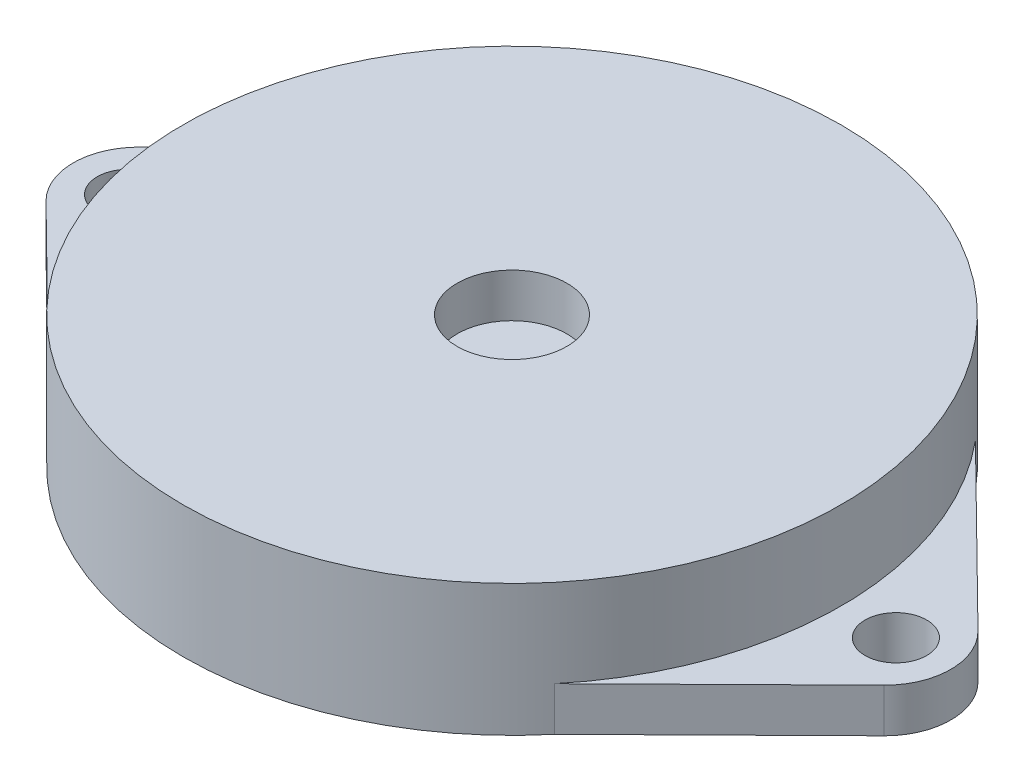
ISO-10303-21;
HEADER;
FILE_DESCRIPTION(('STEP AP214'),'2;1');
FILE_NAME('part.step','',(''),(''),'','','');
FILE_SCHEMA(('AUTOMOTIVE_DESIGN { 1 0 10303 214 1 1 1 1 }'));
ENDSEC;
DATA;
#1=APPLICATION_CONTEXT('core data for automotive mechanical design processes');
#2=APPLICATION_PROTOCOL_DEFINITION('international standard','automotive_design',2000,#1);
#3=PRODUCT_CONTEXT('',#1,'mechanical');
#4=PRODUCT('Part','Part','',(#3));
#5=PRODUCT_RELATED_PRODUCT_CATEGORY('part','',(#4));
#6=PRODUCT_DEFINITION_FORMATION('','',#4);
#7=PRODUCT_DEFINITION_CONTEXT('part definition',#1,'design');
#8=PRODUCT_DEFINITION('design','',#6,#7);
#9=PRODUCT_DEFINITION_SHAPE('','',#8);
#10=(LENGTH_UNIT() NAMED_UNIT(*) SI_UNIT(.MILLI.,.METRE.));
#11=(NAMED_UNIT(*) PLANE_ANGLE_UNIT() SI_UNIT($,.RADIAN.));
#12=(NAMED_UNIT(*) SI_UNIT($,.STERADIAN.) SOLID_ANGLE_UNIT());
#13=UNCERTAINTY_MEASURE_WITH_UNIT(LENGTH_MEASURE(1.E-05),#10,'distance_accuracy_value','');
#14=(GEOMETRIC_REPRESENTATION_CONTEXT(3) GLOBAL_UNCERTAINTY_ASSIGNED_CONTEXT((#13)) GLOBAL_UNIT_ASSIGNED_CONTEXT((#10,
#11,#12)) REPRESENTATION_CONTEXT('',''));
#15=CARTESIAN_POINT('',(0.,0.,0.));
#16=DIRECTION('',(0.,0.,1.));
#17=DIRECTION('',(1.,0.,0.));
#18=AXIS2_PLACEMENT_3D('',#15,#16,#17);
#19=CARTESIAN_POINT('',(0.,6.,0.));
#20=DIRECTION('',(0.,-1.,0.));
#21=DIRECTION('',(0.,0.,-1.));
#22=AXIS2_PLACEMENT_3D('',#19,#20,#21);
#23=CYLINDRICAL_SURFACE('',#22,15.);
#24=CARTESIAN_POINT('',(0.,0.,0.));
#25=DIRECTION('',(0.,1.,0.));
#26=DIRECTION('',(0.,0.,1.));
#27=AXIS2_PLACEMENT_3D('',#24,#25,#26);
#28=CIRCLE('',#27,15.);
#29=CARTESIAN_POINT('',(11.5272476160853,0.,-9.59804992680577));
#30=VERTEX_POINT('',#29);
#31=CARTESIAN_POINT('',(-11.5272476160853,0.,-9.59804992680576));
#32=VERTEX_POINT('',#31);
#33=EDGE_CURVE('E172',#30,#32,#28,.T.);
#34=ORIENTED_EDGE('',*,*,#33,.T.);
#35=DIRECTION('',(0.,-1.,0.));
#36=VECTOR('',#35,1.);
#37=CARTESIAN_POINT('',(-11.5272476160853,6.,-9.59804992680579));
#38=LINE('',#37,#36);
#39=CARTESIAN_POINT('',(-11.5272476160853,2.,-9.59804992680576));
#40=VERTEX_POINT('',#39);
#41=EDGE_CURVE('E166',#32,#40,#38,.F.);
#42=ORIENTED_EDGE('',*,*,#41,.T.);
#43=CARTESIAN_POINT('',(0.,2.,0.));
#44=DIRECTION('',(0.,1.,0.));
#45=DIRECTION('',(0.,0.,1.));
#46=AXIS2_PLACEMENT_3D('',#43,#44,#45);
#47=CIRCLE('',#46,15.);
#48=CARTESIAN_POINT('',(-11.5272476160853,2.,9.59804992680578));
#49=VERTEX_POINT('',#48);
#50=EDGE_CURVE('E44',#40,#49,#47,.T.);
#51=ORIENTED_EDGE('',*,*,#50,.T.);
#52=DIRECTION('',(0.,-1.,0.));
#53=VECTOR('',#52,1.);
#54=CARTESIAN_POINT('',(-11.5272476160853,6.,9.59804992680579));
#55=LINE('',#54,#53);
#56=CARTESIAN_POINT('',(-11.5272476160853,0.,9.59804992680577));
#57=VERTEX_POINT('',#56);
#58=EDGE_CURVE('E161',#49,#57,#55,.T.);
#59=ORIENTED_EDGE('',*,*,#58,.T.);
#60=CARTESIAN_POINT('',(11.5272476160853,0.,9.59804992680578));
#61=VERTEX_POINT('',#60);
#62=EDGE_CURVE('E178',#57,#61,#28,.T.);
#63=ORIENTED_EDGE('',*,*,#62,.T.);
#64=DIRECTION('',(0.,-1.,0.));
#65=VECTOR('',#64,1.);
#66=CARTESIAN_POINT('',(11.5272476160853,6.,9.59804992680579));
#67=LINE('',#66,#65);
#68=CARTESIAN_POINT('',(11.5272476160853,2.,9.59804992680576));
#69=VERTEX_POINT('',#68);
#70=EDGE_CURVE('E51',#61,#69,#67,.F.);
#71=ORIENTED_EDGE('',*,*,#70,.T.);
#72=CARTESIAN_POINT('',(0.,2.,0.));
#73=DIRECTION('',(0.,-1.,0.));
#74=DIRECTION('',(0.,0.,-1.));
#75=AXIS2_PLACEMENT_3D('',#72,#73,#74);
#76=CIRCLE('',#75,15.);
#77=CARTESIAN_POINT('',(11.5272476160853,2.,-9.59804992680578));
#78=VERTEX_POINT('',#77);
#79=EDGE_CURVE('E11',#78,#69,#76,.T.);
#80=ORIENTED_EDGE('',*,*,#79,.F.);
#81=DIRECTION('',(0.,-1.,0.));
#82=VECTOR('',#81,1.);
#83=CARTESIAN_POINT('',(11.5272476160853,6.,-9.59804992680574));
#84=LINE('',#83,#82);
#85=EDGE_CURVE('E134',#78,#30,#84,.T.);
#86=ORIENTED_EDGE('',*,*,#85,.T.);
#87=EDGE_LOOP('',(#34,#42,#51,#59,#63,#71,#80,#86));
#88=FACE_BOUND('',#87,.T.);
#89=CARTESIAN_POINT('',(0.,6.,0.));
#90=DIRECTION('',(0.,1.,0.));
#91=DIRECTION('',(0.,0.,1.));
#92=AXIS2_PLACEMENT_3D('',#89,#90,#91);
#93=CIRCLE('',#92,15.);
#94=CARTESIAN_POINT('',(0.,6.,15.));
#95=VERTEX_POINT('',#94);
#96=EDGE_CURVE('E175',#95,#95,#93,.T.);
#97=ORIENTED_EDGE('',*,*,#96,.F.);
#98=EDGE_LOOP('',(#97));
#99=FACE_BOUND('',#98,.T.);
#100=ADVANCED_FACE('F37',(#88,#99),#23,.T.);
#101=CARTESIAN_POINT('',(0.,6.,0.));
#102=DIRECTION('',(0.,1.,0.));
#103=DIRECTION('',(0.,0.,1.));
#104=AXIS2_PLACEMENT_3D('',#101,#102,#103);
#105=PLANE('',#104);
#106=CARTESIAN_POINT('',(0.,6.,0.));
#107=DIRECTION('',(0.,1.,0.));
#108=DIRECTION('',(0.,0.,1.));
#109=AXIS2_PLACEMENT_3D('',#106,#107,#108);
#110=CIRCLE('',#109,2.5);
#111=CARTESIAN_POINT('',(0.,6.,2.5));
#112=VERTEX_POINT('',#111);
#113=EDGE_CURVE('E168',#112,#112,#110,.T.);
#114=ORIENTED_EDGE('',*,*,#113,.F.);
#115=EDGE_LOOP('',(#114));
#116=FACE_BOUND('',#115,.T.);
#117=ORIENTED_EDGE('',*,*,#96,.T.);
#118=EDGE_LOOP('',(#117));
#119=FACE_BOUND('',#118,.T.);
#120=ADVANCED_FACE('F213',(#116,#119),#105,.T.);
#121=CARTESIAN_POINT('',(0.,0.,0.));
#122=DIRECTION('',(0.,1.,0.));
#123=DIRECTION('',(0.,0.,1.));
#124=AXIS2_PLACEMENT_3D('',#121,#122,#123);
#125=PLANE('',#124);
#126=DIRECTION('',(-0.712596802448825,0.,0.701573800209009));
#127=VECTOR('',#126,1.);
#128=CARTESIAN_POINT('',(9.4171922879189,0.,11.6754652760548));
#129=LINE('',#128,#127);
#130=CARTESIAN_POINT('',(19.104721400627,0.,2.13779040734648));
#131=VERTEX_POINT('',#130);
#132=EDGE_CURVE('E103',#131,#61,#129,.T.);
#133=ORIENTED_EDGE('',*,*,#132,.T.);
#134=ORIENTED_EDGE('',*,*,#62,.F.);
#135=DIRECTION('',(-0.712596802448825,0.,-0.701573800209009));
#136=VECTOR('',#135,1.);
#137=CARTESIAN_POINT('',(-9.4171922879189,0.,11.6754652760548));
#138=LINE('',#137,#136);
#139=CARTESIAN_POINT('',(-19.104721400627,0.,2.13779040734648));
#140=VERTEX_POINT('',#139);
#141=EDGE_CURVE('E140',#57,#140,#138,.T.);
#142=ORIENTED_EDGE('',*,*,#141,.T.);
#143=CARTESIAN_POINT('',(-17.,0.,0.));
#144=DIRECTION('',(0.,-1.,0.));
#145=DIRECTION('',(0.,0.,1.));
#146=AXIS2_PLACEMENT_3D('',#143,#144,#145);
#147=CIRCLE('',#146,3.);
#148=CARTESIAN_POINT('',(-19.104721400627,0.,-2.13779040734648));
#149=VERTEX_POINT('',#148);
#150=EDGE_CURVE('E154',#140,#149,#147,.T.);
#151=ORIENTED_EDGE('',*,*,#150,.T.);
#152=DIRECTION('',(0.712596802448825,0.,-0.701573800209009));
#153=VECTOR('',#152,1.);
#154=CARTESIAN_POINT('',(-9.4171922879189,0.,-11.6754652760548));
#155=LINE('',#154,#153);
#156=EDGE_CURVE('E146',#149,#32,#155,.T.);
#157=ORIENTED_EDGE('',*,*,#156,.T.);
#158=ORIENTED_EDGE('',*,*,#33,.F.);
#159=DIRECTION('',(0.712596802448825,0.,0.701573800209009));
#160=VECTOR('',#159,1.);
#161=CARTESIAN_POINT('',(9.4171922879189,0.,-11.6754652760548));
#162=LINE('',#161,#160);
#163=CARTESIAN_POINT('',(19.104721400627,0.,-2.13779040734648));
#164=VERTEX_POINT('',#163);
#165=EDGE_CURVE('E120',#30,#164,#162,.T.);
#166=ORIENTED_EDGE('',*,*,#165,.T.);
#167=CARTESIAN_POINT('',(17.,0.,0.));
#168=DIRECTION('',(0.,-1.,0.));
#169=DIRECTION('',(0.,0.,-1.));
#170=AXIS2_PLACEMENT_3D('',#167,#168,#169);
#171=CIRCLE('',#170,3.);
#172=EDGE_CURVE('E128',#164,#131,#171,.T.);
#173=ORIENTED_EDGE('',*,*,#172,.T.);
#174=EDGE_LOOP('',(#133,#134,#142,#151,#157,#158,#166,#173));
#175=FACE_BOUND('',#174,.T.);
#176=CARTESIAN_POINT('',(-17.5,0.,0.));
#177=DIRECTION('',(0.,-1.,0.));
#178=DIRECTION('',(0.,0.,-1.));
#179=AXIS2_PLACEMENT_3D('',#176,#177,#178);
#180=CIRCLE('',#179,1.40543951031206);
#181=CARTESIAN_POINT('',(-17.5,0.,-1.40543951031206));
#182=VERTEX_POINT('',#181);
#183=EDGE_CURVE('E136',#182,#182,#180,.T.);
#184=ORIENTED_EDGE('',*,*,#183,.F.);
#185=EDGE_LOOP('',(#184));
#186=FACE_BOUND('',#185,.T.);
#187=CARTESIAN_POINT('',(17.5,0.,0.));
#188=DIRECTION('',(0.,-1.,0.));
#189=DIRECTION('',(0.,0.,1.));
#190=AXIS2_PLACEMENT_3D('',#187,#188,#189);
#191=CIRCLE('',#190,1.40543951031206);
#192=CARTESIAN_POINT('',(17.5,0.,1.40543951031206));
#193=VERTEX_POINT('',#192);
#194=EDGE_CURVE('E124',#193,#193,#191,.T.);
#195=ORIENTED_EDGE('',*,*,#194,.F.);
#196=EDGE_LOOP('',(#195));
#197=FACE_BOUND('',#196,.T.);
#198=ADVANCED_FACE('F197',(#175,#186,#197),#125,.F.);
#199=CARTESIAN_POINT('',(0.,4.,0.));
#200=DIRECTION('',(0.,1.,0.));
#201=DIRECTION('',(0.,0.,1.));
#202=AXIS2_PLACEMENT_3D('',#199,#200,#201);
#203=CYLINDRICAL_SURFACE('',#202,2.5);
#204=CARTESIAN_POINT('',(0.,4.,0.));
#205=DIRECTION('',(0.,1.,0.));
#206=DIRECTION('',(0.,0.,1.));
#207=AXIS2_PLACEMENT_3D('',#204,#205,#206);
#208=CIRCLE('',#207,2.5);
#209=CARTESIAN_POINT('',(0.,4.,2.5));
#210=VERTEX_POINT('',#209);
#211=EDGE_CURVE('E169',#210,#210,#208,.T.);
#212=ORIENTED_EDGE('',*,*,#211,.F.);
#213=EDGE_LOOP('',(#212));
#214=FACE_BOUND('',#213,.T.);
#215=ORIENTED_EDGE('',*,*,#113,.T.);
#216=EDGE_LOOP('',(#215));
#217=FACE_BOUND('',#216,.T.);
#218=ADVANCED_FACE('F222',(#214,#217),#203,.F.);
#219=CARTESIAN_POINT('',(0.,4.,0.));
#220=DIRECTION('',(0.,1.,0.));
#221=DIRECTION('',(0.,0.,1.));
#222=AXIS2_PLACEMENT_3D('',#219,#220,#221);
#223=PLANE('',#222);
#224=ORIENTED_EDGE('',*,*,#211,.T.);
#225=EDGE_LOOP('',(#224));
#226=FACE_BOUND('',#225,.T.);
#227=ADVANCED_FACE('F208',(#226),#223,.T.);
#228=CARTESIAN_POINT('',(-17.,2.,0.));
#229=DIRECTION('',(0.,1.,0.));
#230=DIRECTION('',(0.,0.,1.));
#231=AXIS2_PLACEMENT_3D('',#228,#229,#230);
#232=PLANE('',#231);
#233=CARTESIAN_POINT('',(-17.5,2.,0.));
#234=DIRECTION('',(0.,-1.,0.));
#235=DIRECTION('',(0.,0.,-1.));
#236=AXIS2_PLACEMENT_3D('',#233,#234,#235);
#237=CIRCLE('',#236,1.40543951031206);
#238=CARTESIAN_POINT('',(-17.5,2.,-1.40543951031206));
#239=VERTEX_POINT('',#238);
#240=EDGE_CURVE('E137',#239,#239,#237,.T.);
#241=ORIENTED_EDGE('',*,*,#240,.T.);
#242=EDGE_LOOP('',(#241));
#243=FACE_BOUND('',#242,.T.);
#244=ORIENTED_EDGE('',*,*,#50,.F.);
#245=DIRECTION('',(0.712596802448825,0.,-0.701573800209009));
#246=VECTOR('',#245,1.);
#247=CARTESIAN_POINT('',(-9.4171922879189,2.,-11.6754652760548));
#248=LINE('',#247,#246);
#249=CARTESIAN_POINT('',(-19.104721400627,2.,-2.13779040734648));
#250=VERTEX_POINT('',#249);
#251=EDGE_CURVE('E149',#250,#40,#248,.T.);
#252=ORIENTED_EDGE('',*,*,#251,.F.);
#253=CARTESIAN_POINT('',(-17.,2.,0.));
#254=DIRECTION('',(0.,-1.,0.));
#255=DIRECTION('',(0.,0.,1.));
#256=AXIS2_PLACEMENT_3D('',#253,#254,#255);
#257=CIRCLE('',#256,3.);
#258=CARTESIAN_POINT('',(-19.104721400627,2.,2.13779040734648));
#259=VERTEX_POINT('',#258);
#260=EDGE_CURVE('E145',#259,#250,#257,.T.);
#261=ORIENTED_EDGE('',*,*,#260,.F.);
#262=DIRECTION('',(-0.712596802448825,0.,-0.701573800209009));
#263=VECTOR('',#262,1.);
#264=CARTESIAN_POINT('',(-9.4171922879189,2.,11.6754652760548));
#265=LINE('',#264,#263);
#266=EDGE_CURVE('E143',#49,#259,#265,.T.);
#267=ORIENTED_EDGE('',*,*,#266,.F.);
#268=EDGE_LOOP('',(#244,#252,#261,#267));
#269=FACE_BOUND('',#268,.T.);
#270=ADVANCED_FACE('F191',(#243,#269),#232,.T.);
#271=CARTESIAN_POINT('',(-9.4171922879189,2.,-11.6754652760548));
#272=DIRECTION('',(-0.701573800209009,0.,-0.712596802448825));
#273=DIRECTION('',(-0.712596802448825,0.,0.701573800209009));
#274=AXIS2_PLACEMENT_3D('',#271,#272,#273);
#275=PLANE('',#274);
#276=ORIENTED_EDGE('',*,*,#41,.F.);
#277=ORIENTED_EDGE('',*,*,#156,.F.);
#278=DIRECTION('',(0.,-1.,0.));
#279=VECTOR('',#278,1.);
#280=CARTESIAN_POINT('',(-19.104721400627,2.,-2.13779040734648));
#281=LINE('',#280,#279);
#282=EDGE_CURVE('E159',#250,#149,#281,.T.);
#283=ORIENTED_EDGE('',*,*,#282,.F.);
#284=ORIENTED_EDGE('',*,*,#251,.T.);
#285=EDGE_LOOP('',(#276,#277,#283,#284));
#286=FACE_BOUND('',#285,.T.);
#287=ADVANCED_FACE('F200',(#286),#275,.T.);
#288=CARTESIAN_POINT('',(-9.4171922879189,2.,11.6754652760548));
#289=DIRECTION('',(-0.701573800209009,0.,0.712596802448825));
#290=DIRECTION('',(0.712596802448825,0.,0.701573800209009));
#291=AXIS2_PLACEMENT_3D('',#288,#289,#290);
#292=PLANE('',#291);
#293=ORIENTED_EDGE('',*,*,#58,.F.);
#294=ORIENTED_EDGE('',*,*,#266,.T.);
#295=DIRECTION('',(0.,-1.,0.));
#296=VECTOR('',#295,1.);
#297=CARTESIAN_POINT('',(-19.104721400627,2.,2.13779040734648));
#298=LINE('',#297,#296);
#299=EDGE_CURVE('E152',#259,#140,#298,.T.);
#300=ORIENTED_EDGE('',*,*,#299,.T.);
#301=ORIENTED_EDGE('',*,*,#141,.F.);
#302=EDGE_LOOP('',(#293,#294,#300,#301));
#303=FACE_BOUND('',#302,.T.);
#304=ADVANCED_FACE('F188',(#303),#292,.T.);
#305=CARTESIAN_POINT('',(-17.,2.,0.));
#306=DIRECTION('',(0.,-1.,0.));
#307=DIRECTION('',(0.,0.,-1.));
#308=AXIS2_PLACEMENT_3D('',#305,#306,#307);
#309=CYLINDRICAL_SURFACE('',#308,3.);
#310=ORIENTED_EDGE('',*,*,#150,.F.);
#311=ORIENTED_EDGE('',*,*,#299,.F.);
#312=ORIENTED_EDGE('',*,*,#260,.T.);
#313=ORIENTED_EDGE('',*,*,#282,.T.);
#314=EDGE_LOOP('',(#310,#311,#312,#313));
#315=FACE_BOUND('',#314,.T.);
#316=ADVANCED_FACE('F194',(#315),#309,.T.);
#317=CARTESIAN_POINT('',(-17.5,2.,0.));
#318=DIRECTION('',(0.,-1.,0.));
#319=DIRECTION('',(0.,0.,-1.));
#320=AXIS2_PLACEMENT_3D('',#317,#318,#319);
#321=CYLINDRICAL_SURFACE('',#320,1.40543951031206);
#322=ORIENTED_EDGE('',*,*,#240,.F.);
#323=EDGE_LOOP('',(#322));
#324=FACE_BOUND('',#323,.T.);
#325=ORIENTED_EDGE('',*,*,#183,.T.);
#326=EDGE_LOOP('',(#325));
#327=FACE_BOUND('',#326,.T.);
#328=ADVANCED_FACE('F232',(#324,#327),#321,.F.);
#329=CARTESIAN_POINT('',(17.,2.,0.));
#330=DIRECTION('',(0.,-1.,0.));
#331=DIRECTION('',(0.,0.,-1.));
#332=AXIS2_PLACEMENT_3D('',#329,#330,#331);
#333=PLANE('',#332);
#334=CARTESIAN_POINT('',(17.5,2.,0.));
#335=DIRECTION('',(0.,-1.,0.));
#336=DIRECTION('',(0.,0.,1.));
#337=AXIS2_PLACEMENT_3D('',#334,#335,#336);
#338=CIRCLE('',#337,1.40543951031206);
#339=CARTESIAN_POINT('',(17.5,2.,1.40543951031206));
#340=VERTEX_POINT('',#339);
#341=EDGE_CURVE('E130',#340,#340,#338,.T.);
#342=ORIENTED_EDGE('',*,*,#341,.T.);
#343=EDGE_LOOP('',(#342));
#344=FACE_BOUND('',#343,.T.);
#345=DIRECTION('',(0.712596802448825,0.,0.701573800209009));
#346=VECTOR('',#345,1.);
#347=CARTESIAN_POINT('',(9.4171922879189,2.,-11.6754652760548));
#348=LINE('',#347,#346);
#349=CARTESIAN_POINT('',(19.104721400627,2.,-2.13779040734648));
#350=VERTEX_POINT('',#349);
#351=EDGE_CURVE('E109',#78,#350,#348,.T.);
#352=ORIENTED_EDGE('',*,*,#351,.F.);
#353=ORIENTED_EDGE('',*,*,#79,.T.);
#354=DIRECTION('',(-0.712596802448825,0.,0.701573800209009));
#355=VECTOR('',#354,1.);
#356=CARTESIAN_POINT('',(9.4171922879189,2.,11.6754652760548));
#357=LINE('',#356,#355);
#358=CARTESIAN_POINT('',(19.104721400627,2.,2.13779040734648));
#359=VERTEX_POINT('',#358);
#360=EDGE_CURVE('E101',#359,#69,#357,.T.);
#361=ORIENTED_EDGE('',*,*,#360,.F.);
#362=CARTESIAN_POINT('',(17.,2.,0.));
#363=DIRECTION('',(0.,-1.,0.));
#364=DIRECTION('',(0.,0.,-1.));
#365=AXIS2_PLACEMENT_3D('',#362,#363,#364);
#366=CIRCLE('',#365,3.);
#367=EDGE_CURVE('E115',#350,#359,#366,.T.);
#368=ORIENTED_EDGE('',*,*,#367,.F.);
#369=EDGE_LOOP('',(#352,#353,#361,#368));
#370=FACE_BOUND('',#369,.T.);
#371=ADVANCED_FACE('F114',(#344,#370),#333,.F.);
#372=CARTESIAN_POINT('',(9.4171922879189,2.,-11.6754652760548));
#373=DIRECTION('',(0.701573800209009,0.,-0.712596802448825));
#374=DIRECTION('',(-0.712596802448825,0.,-0.701573800209009));
#375=AXIS2_PLACEMENT_3D('',#372,#373,#374);
#376=PLANE('',#375);
#377=ORIENTED_EDGE('',*,*,#85,.F.);
#378=ORIENTED_EDGE('',*,*,#351,.T.);
#379=DIRECTION('',(0.,-1.,0.));
#380=VECTOR('',#379,1.);
#381=CARTESIAN_POINT('',(19.104721400627,2.,-2.13779040734648));
#382=LINE('',#381,#380);
#383=EDGE_CURVE('E108',#350,#164,#382,.T.);
#384=ORIENTED_EDGE('',*,*,#383,.T.);
#385=ORIENTED_EDGE('',*,*,#165,.F.);
#386=EDGE_LOOP('',(#377,#378,#384,#385));
#387=FACE_BOUND('',#386,.T.);
#388=ADVANCED_FACE('F241',(#387),#376,.T.);
#389=CARTESIAN_POINT('',(9.4171922879189,2.,11.6754652760548));
#390=DIRECTION('',(0.701573800209009,0.,0.712596802448825));
#391=DIRECTION('',(0.712596802448825,0.,-0.701573800209009));
#392=AXIS2_PLACEMENT_3D('',#389,#390,#391);
#393=PLANE('',#392);
#394=ORIENTED_EDGE('',*,*,#70,.F.);
#395=ORIENTED_EDGE('',*,*,#132,.F.);
#396=DIRECTION('',(0.,-1.,0.));
#397=VECTOR('',#396,1.);
#398=CARTESIAN_POINT('',(19.104721400627,2.,2.13779040734648));
#399=LINE('',#398,#397);
#400=EDGE_CURVE('E98',#359,#131,#399,.T.);
#401=ORIENTED_EDGE('',*,*,#400,.F.);
#402=ORIENTED_EDGE('',*,*,#360,.T.);
#403=EDGE_LOOP('',(#394,#395,#401,#402));
#404=FACE_BOUND('',#403,.T.);
#405=ADVANCED_FACE('F100',(#404),#393,.T.);
#406=CARTESIAN_POINT('',(17.,2.,0.));
#407=DIRECTION('',(0.,-1.,0.));
#408=DIRECTION('',(0.,0.,-1.));
#409=AXIS2_PLACEMENT_3D('',#406,#407,#408);
#410=CYLINDRICAL_SURFACE('',#409,3.);
#411=ORIENTED_EDGE('',*,*,#172,.F.);
#412=ORIENTED_EDGE('',*,*,#383,.F.);
#413=ORIENTED_EDGE('',*,*,#367,.T.);
#414=ORIENTED_EDGE('',*,*,#400,.T.);
#415=EDGE_LOOP('',(#411,#412,#413,#414));
#416=FACE_BOUND('',#415,.T.);
#417=ADVANCED_FACE('F118',(#416),#410,.T.);
#418=CARTESIAN_POINT('',(17.5,2.,0.));
#419=DIRECTION('',(0.,-1.,0.));
#420=DIRECTION('',(0.,0.,-1.));
#421=AXIS2_PLACEMENT_3D('',#418,#419,#420);
#422=CYLINDRICAL_SURFACE('',#421,1.40543951031206);
#423=ORIENTED_EDGE('',*,*,#341,.F.);
#424=EDGE_LOOP('',(#423));
#425=FACE_BOUND('',#424,.T.);
#426=ORIENTED_EDGE('',*,*,#194,.T.);
#427=EDGE_LOOP('',(#426));
#428=FACE_BOUND('',#427,.T.);
#429=ADVANCED_FACE('F249',(#425,#428),#422,.F.);
#430=CLOSED_SHELL('',(#100,#120,#198,#218,#227,#270,#287,#304,#316,#328,#371,#388,#405,#417,#429));
#431=MANIFOLD_SOLID_BREP('B2',#430);
#432=ADVANCED_BREP_SHAPE_REPRESENTATION('',(#18,#431),#14);
#433=SHAPE_DEFINITION_REPRESENTATION(#9,#432);
ENDSEC;
END-ISO-10303-21;
